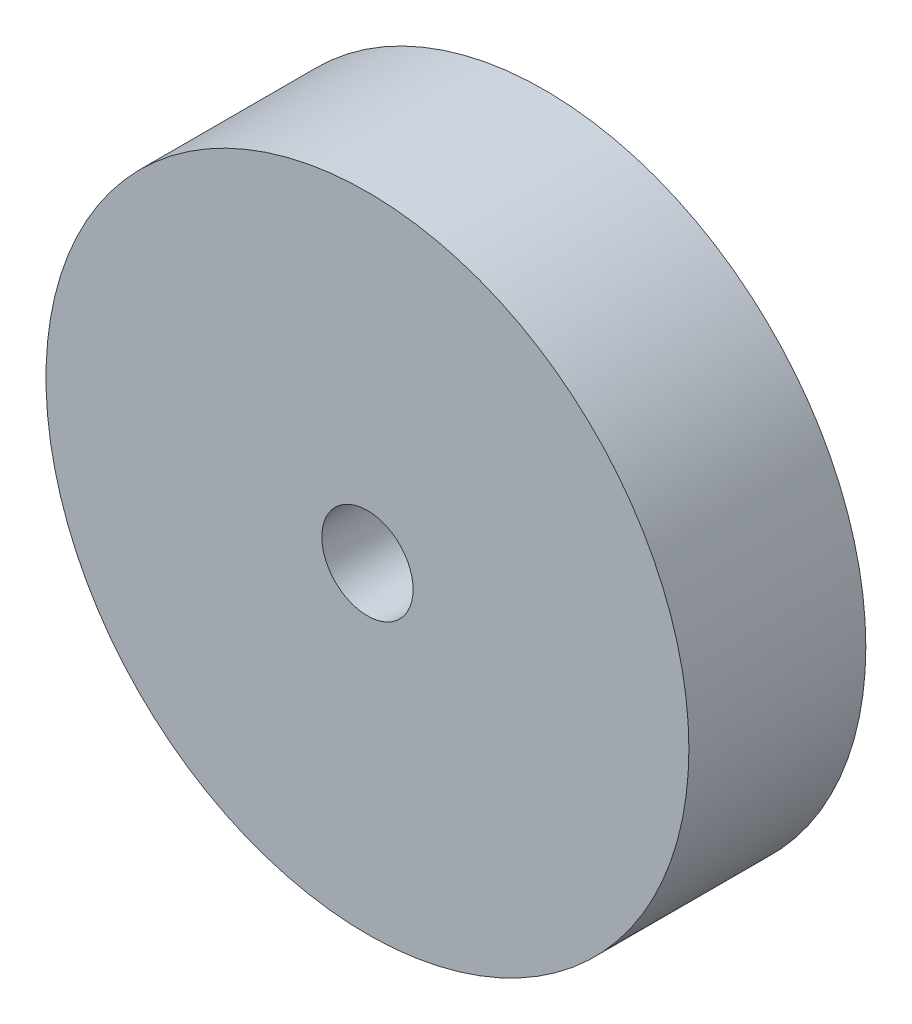
ISO-10303-21;
HEADER;
FILE_DESCRIPTION(('STEP AP214'),'2;1');
FILE_NAME('part.step','',(''),(''),'','','');
FILE_SCHEMA(('AUTOMOTIVE_DESIGN { 1 0 10303 214 1 1 1 1 }'));
ENDSEC;
DATA;
#1=APPLICATION_CONTEXT('core data for automotive mechanical design processes');
#2=APPLICATION_PROTOCOL_DEFINITION('international standard','automotive_design',2000,#1);
#3=PRODUCT_CONTEXT('',#1,'mechanical');
#4=PRODUCT('Part','Part','',(#3));
#5=PRODUCT_RELATED_PRODUCT_CATEGORY('part','',(#4));
#6=PRODUCT_DEFINITION_FORMATION('','',#4);
#7=PRODUCT_DEFINITION_CONTEXT('part definition',#1,'design');
#8=PRODUCT_DEFINITION('design','',#6,#7);
#9=PRODUCT_DEFINITION_SHAPE('','',#8);
#10=(LENGTH_UNIT() NAMED_UNIT(*) SI_UNIT(.MILLI.,.METRE.));
#11=(NAMED_UNIT(*) PLANE_ANGLE_UNIT() SI_UNIT($,.RADIAN.));
#12=(NAMED_UNIT(*) SI_UNIT($,.STERADIAN.) SOLID_ANGLE_UNIT());
#13=UNCERTAINTY_MEASURE_WITH_UNIT(LENGTH_MEASURE(1.E-05),#10,'distance_accuracy_value','');
#14=(GEOMETRIC_REPRESENTATION_CONTEXT(3) GLOBAL_UNCERTAINTY_ASSIGNED_CONTEXT((#13)) GLOBAL_UNIT_ASSIGNED_CONTEXT((#10,
#11,#12)) REPRESENTATION_CONTEXT('',''));
#15=CARTESIAN_POINT('',(0.,0.,0.));
#16=DIRECTION('',(0.,0.,1.));
#17=DIRECTION('',(1.,0.,0.));
#18=AXIS2_PLACEMENT_3D('',#15,#16,#17);
#19=CARTESIAN_POINT('',(0.,0.,6.88));
#20=DIRECTION('',(0.,0.,1.));
#21=DIRECTION('',(1.,0.,0.));
#22=AXIS2_PLACEMENT_3D('',#19,#20,#21);
#23=PLANE('',#22);
#24=CARTESIAN_POINT('',(0.,0.,6.88));
#25=DIRECTION('',(0.,0.,1.));
#26=DIRECTION('',(1.,0.,0.));
#27=AXIS2_PLACEMENT_3D('',#24,#25,#26);
#28=CIRCLE('',#27,12.5);
#29=CARTESIAN_POINT('',(12.5,0.,6.88));
#30=VERTEX_POINT('',#29);
#31=EDGE_CURVE('E10',#30,#30,#28,.T.);
#32=ORIENTED_EDGE('',*,*,#31,.T.);
#33=EDGE_LOOP('',(#32));
#34=FACE_BOUND('',#33,.T.);
#35=CARTESIAN_POINT('',(0.,0.,6.88));
#36=DIRECTION('',(0.,0.,1.));
#37=DIRECTION('',(1.,0.,0.));
#38=AXIS2_PLACEMENT_3D('',#35,#36,#37);
#39=CIRCLE('',#38,1.775);
#40=CARTESIAN_POINT('',(1.775,0.,6.88));
#41=VERTEX_POINT('',#40);
#42=EDGE_CURVE('E53',#41,#41,#39,.T.);
#43=ORIENTED_EDGE('',*,*,#42,.F.);
#44=EDGE_LOOP('',(#43));
#45=FACE_BOUND('',#44,.T.);
#46=ADVANCED_FACE('F41',(#34,#45),#23,.T.);
#47=CARTESIAN_POINT('',(0.,0.,0.));
#48=DIRECTION('',(0.,0.,1.));
#49=DIRECTION('',(1.,0.,0.));
#50=AXIS2_PLACEMENT_3D('',#47,#48,#49);
#51=PLANE('',#50);
#52=CARTESIAN_POINT('',(0.,0.,0.));
#53=DIRECTION('',(0.,0.,1.));
#54=DIRECTION('',(1.,0.,0.));
#55=AXIS2_PLACEMENT_3D('',#52,#53,#54);
#56=CIRCLE('',#55,12.5);
#57=CARTESIAN_POINT('',(12.5,0.,0.));
#58=VERTEX_POINT('',#57);
#59=EDGE_CURVE('E45',#58,#58,#56,.T.);
#60=ORIENTED_EDGE('',*,*,#59,.F.);
#61=EDGE_LOOP('',(#60));
#62=FACE_BOUND('',#61,.T.);
#63=CARTESIAN_POINT('',(0.,0.,0.));
#64=DIRECTION('',(0.,0.,1.));
#65=DIRECTION('',(1.,0.,0.));
#66=AXIS2_PLACEMENT_3D('',#63,#64,#65);
#67=CIRCLE('',#66,1.775);
#68=CARTESIAN_POINT('',(1.775,0.,0.));
#69=VERTEX_POINT('',#68);
#70=EDGE_CURVE('E55',#69,#69,#67,.T.);
#71=ORIENTED_EDGE('',*,*,#70,.T.);
#72=EDGE_LOOP('',(#71));
#73=FACE_BOUND('',#72,.T.);
#74=ADVANCED_FACE('F65',(#62,#73),#51,.F.);
#75=CARTESIAN_POINT('',(0.,0.,6.88));
#76=DIRECTION('',(0.,0.,-1.));
#77=DIRECTION('',(-1.,0.,0.));
#78=AXIS2_PLACEMENT_3D('',#75,#76,#77);
#79=CYLINDRICAL_SURFACE('',#78,12.5);
#80=ORIENTED_EDGE('',*,*,#31,.F.);
#81=EDGE_LOOP('',(#80));
#82=FACE_BOUND('',#81,.T.);
#83=ORIENTED_EDGE('',*,*,#59,.T.);
#84=EDGE_LOOP('',(#83));
#85=FACE_BOUND('',#84,.T.);
#86=ADVANCED_FACE('F43',(#82,#85),#79,.T.);
#87=CARTESIAN_POINT('',(0.,0.,6.88));
#88=DIRECTION('',(0.,0.,-1.));
#89=DIRECTION('',(-1.,0.,0.));
#90=AXIS2_PLACEMENT_3D('',#87,#88,#89);
#91=CYLINDRICAL_SURFACE('',#90,1.775);
#92=ORIENTED_EDGE('',*,*,#42,.T.);
#93=EDGE_LOOP('',(#92));
#94=FACE_BOUND('',#93,.T.);
#95=ORIENTED_EDGE('',*,*,#70,.F.);
#96=EDGE_LOOP('',(#95));
#97=FACE_BOUND('',#96,.T.);
#98=ADVANCED_FACE('F61',(#94,#97),#91,.F.);
#99=CLOSED_SHELL('',(#46,#74,#86,#98));
#100=MANIFOLD_SOLID_BREP('B2',#99);
#101=ADVANCED_BREP_SHAPE_REPRESENTATION('',(#18,#100),#14);
#102=SHAPE_DEFINITION_REPRESENTATION(#9,#101);
ENDSEC;
END-ISO-10303-21;
